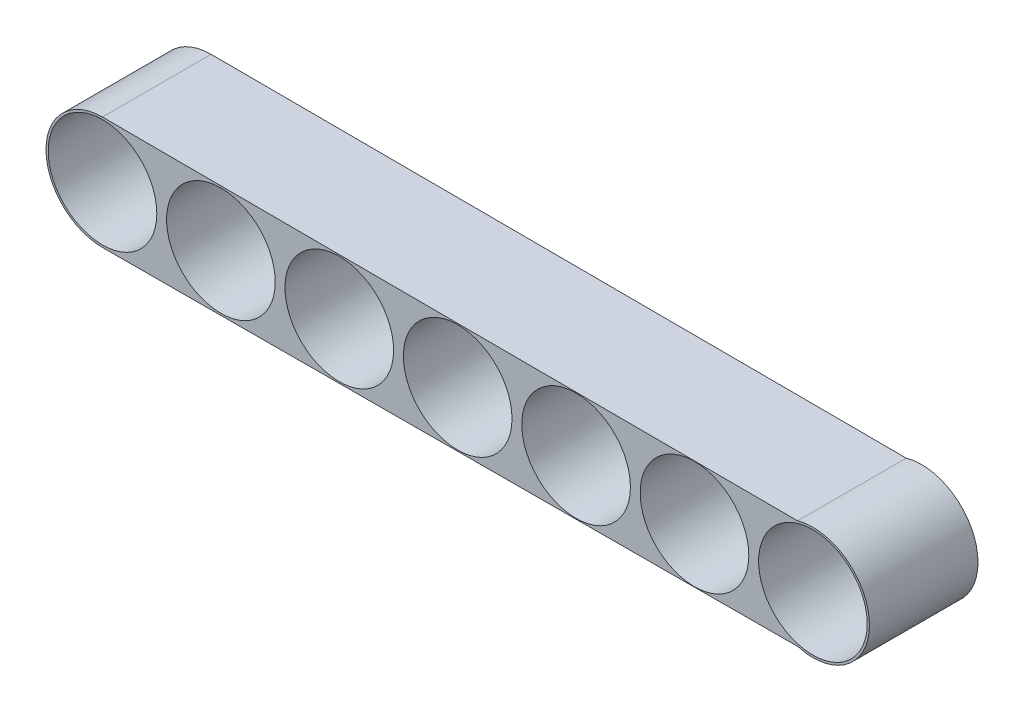
ISO-10303-21;
HEADER;
FILE_DESCRIPTION(('STEP AP214'),'2;1');
FILE_NAME('part.step','',(''),(''),'','','');
FILE_SCHEMA(('AUTOMOTIVE_DESIGN { 1 0 10303 214 1 1 1 1 }'));
ENDSEC;
DATA;
#1=APPLICATION_CONTEXT('core data for automotive mechanical design processes');
#2=APPLICATION_PROTOCOL_DEFINITION('international standard','automotive_design',2000,#1);
#3=PRODUCT_CONTEXT('',#1,'mechanical');
#4=PRODUCT('Part','Part','',(#3));
#5=PRODUCT_RELATED_PRODUCT_CATEGORY('part','',(#4));
#6=PRODUCT_DEFINITION_FORMATION('','',#4);
#7=PRODUCT_DEFINITION_CONTEXT('part definition',#1,'design');
#8=PRODUCT_DEFINITION('design','',#6,#7);
#9=PRODUCT_DEFINITION_SHAPE('','',#8);
#10=(LENGTH_UNIT() NAMED_UNIT(*) SI_UNIT(.MILLI.,.METRE.));
#11=(NAMED_UNIT(*) PLANE_ANGLE_UNIT() SI_UNIT($,.RADIAN.));
#12=(NAMED_UNIT(*) SI_UNIT($,.STERADIAN.) SOLID_ANGLE_UNIT());
#13=UNCERTAINTY_MEASURE_WITH_UNIT(LENGTH_MEASURE(1.E-05),#10,'distance_accuracy_value','');
#14=(GEOMETRIC_REPRESENTATION_CONTEXT(3) GLOBAL_UNCERTAINTY_ASSIGNED_CONTEXT((#13)) GLOBAL_UNIT_ASSIGNED_CONTEXT((#10,
#11,#12)) REPRESENTATION_CONTEXT('',''));
#15=CARTESIAN_POINT('',(0.,0.,0.));
#16=DIRECTION('',(0.,0.,1.));
#17=DIRECTION('',(1.,0.,0.));
#18=AXIS2_PLACEMENT_3D('',#15,#16,#17);
#19=CARTESIAN_POINT('',(0.00159019919573551,-0.519995137005517,1.));
#20=DIRECTION('',(-0.00305808967594135,0.999995324032835,0.));
#21=DIRECTION('',(-0.999995324032835,-0.00305808967594135,0.));
#22=AXIS2_PLACEMENT_3D('',#19,#20,#21);
#23=PLANE('',#22);
#24=DIRECTION('',(0.999995324032835,0.00305808967594135,0.));
#25=VECTOR('',#24,1.);
#26=CARTESIAN_POINT('',(0.00159019919573551,-0.519995137005517,0.));
#27=LINE('',#26,#25);
#28=CARTESIAN_POINT('',(0.,-0.52,0.));
#29=VERTEX_POINT('',#28);
#30=CARTESIAN_POINT('',(6.39869295269132,-0.500432131643146,0.));
#31=VERTEX_POINT('',#30);
#32=EDGE_CURVE('E120',#29,#31,#27,.T.);
#33=ORIENTED_EDGE('',*,*,#32,.T.);
#34=DIRECTION('',(0.,0.,-1.));
#35=VECTOR('',#34,1.);
#36=CARTESIAN_POINT('',(6.39869295269132,-0.500432131643146,1.));
#37=LINE('',#36,#35);
#38=CARTESIAN_POINT('',(6.39869295269132,-0.500432131643146,1.));
#39=VERTEX_POINT('',#38);
#40=EDGE_CURVE('E11',#39,#31,#37,.T.);
#41=ORIENTED_EDGE('',*,*,#40,.F.);
#42=DIRECTION('',(0.999995324032835,0.00305808967594135,0.));
#43=VECTOR('',#42,1.);
#44=CARTESIAN_POINT('',(0.00159019919573551,-0.519995137005517,1.));
#45=LINE('',#44,#43);
#46=CARTESIAN_POINT('',(0.,-0.52,1.));
#47=VERTEX_POINT('',#46);
#48=EDGE_CURVE('E84',#47,#39,#45,.T.);
#49=ORIENTED_EDGE('',*,*,#48,.F.);
#50=DIRECTION('',(0.,0.,-1.));
#51=VECTOR('',#50,1.);
#52=CARTESIAN_POINT('',(0.,-0.52,1.));
#53=LINE('',#52,#51);
#54=EDGE_CURVE('E116',#47,#29,#53,.T.);
#55=ORIENTED_EDGE('',*,*,#54,.T.);
#56=EDGE_LOOP('',(#33,#41,#49,#55));
#57=FACE_BOUND('',#56,.T.);
#58=ADVANCED_FACE('F35',(#57),#23,.F.);
#59=CARTESIAN_POINT('',(6.54,0.,1.));
#60=DIRECTION('',(0.,0.,-1.));
#61=DIRECTION('',(-1.,0.,0.));
#62=AXIS2_PLACEMENT_3D('',#59,#60,#61);
#63=CYLINDRICAL_SURFACE('',#62,0.519999999999999);
#64=CARTESIAN_POINT('',(6.54,0.,0.));
#65=DIRECTION('',(0.,0.,1.));
#66=DIRECTION('',(1.,0.,0.));
#67=AXIS2_PLACEMENT_3D('',#64,#65,#66);
#68=CIRCLE('',#67,0.519999999999999);
#69=CARTESIAN_POINT('',(6.39869295269132,0.500432131643146,0.));
#70=VERTEX_POINT('',#69);
#71=EDGE_CURVE('E89',#31,#70,#68,.T.);
#72=ORIENTED_EDGE('',*,*,#71,.T.);
#73=DIRECTION('',(0.,0.,-1.));
#74=VECTOR('',#73,1.);
#75=CARTESIAN_POINT('',(6.39869295269132,0.500432131643146,1.));
#76=LINE('',#75,#74);
#77=CARTESIAN_POINT('',(6.39869295269132,0.500432131643146,1.));
#78=VERTEX_POINT('',#77);
#79=EDGE_CURVE('E44',#78,#70,#76,.T.);
#80=ORIENTED_EDGE('',*,*,#79,.F.);
#81=CARTESIAN_POINT('',(6.54,0.,1.));
#82=DIRECTION('',(0.,0.,1.));
#83=DIRECTION('',(1.,0.,0.));
#84=AXIS2_PLACEMENT_3D('',#81,#82,#83);
#85=CIRCLE('',#84,0.519999999999999);
#86=EDGE_CURVE('E78',#39,#78,#85,.T.);
#87=ORIENTED_EDGE('',*,*,#86,.F.);
#88=ORIENTED_EDGE('',*,*,#40,.T.);
#89=EDGE_LOOP('',(#72,#80,#87,#88));
#90=FACE_BOUND('',#89,.T.);
#91=ADVANCED_FACE('F88',(#90),#63,.T.);
#92=CARTESIAN_POINT('',(0.00159019919573551,0.519995137005517,1.));
#93=DIRECTION('',(0.00305808967594135,0.999995324032835,0.));
#94=DIRECTION('',(-0.999995324032835,0.00305808967594135,0.));
#95=AXIS2_PLACEMENT_3D('',#92,#93,#94);
#96=PLANE('',#95);
#97=DIRECTION('',(0.999995324032835,-0.00305808967594135,0.));
#98=VECTOR('',#97,1.);
#99=CARTESIAN_POINT('',(0.00159019919573551,0.519995137005517,0.));
#100=LINE('',#99,#98);
#101=CARTESIAN_POINT('',(0.,0.52,0.));
#102=VERTEX_POINT('',#101);
#103=EDGE_CURVE('E124',#102,#70,#100,.T.);
#104=ORIENTED_EDGE('',*,*,#103,.F.);
#105=DIRECTION('',(0.,0.,-1.));
#106=VECTOR('',#105,1.);
#107=CARTESIAN_POINT('',(0.,0.52,1.));
#108=LINE('',#107,#106);
#109=CARTESIAN_POINT('',(0.,0.52,1.));
#110=VERTEX_POINT('',#109);
#111=EDGE_CURVE('E68',#110,#102,#108,.T.);
#112=ORIENTED_EDGE('',*,*,#111,.F.);
#113=DIRECTION('',(0.999995324032835,-0.00305808967594135,0.));
#114=VECTOR('',#113,1.);
#115=CARTESIAN_POINT('',(0.00159019919573551,0.519995137005517,1.));
#116=LINE('',#115,#114);
#117=EDGE_CURVE('E82',#110,#78,#116,.T.);
#118=ORIENTED_EDGE('',*,*,#117,.T.);
#119=ORIENTED_EDGE('',*,*,#79,.T.);
#120=EDGE_LOOP('',(#104,#112,#118,#119));
#121=FACE_BOUND('',#120,.T.);
#122=ADVANCED_FACE('F93',(#121),#96,.T.);
#123=CARTESIAN_POINT('',(1.09,0.,1.));
#124=DIRECTION('',(0.,0.,-1.));
#125=DIRECTION('',(-1.,0.,0.));
#126=AXIS2_PLACEMENT_3D('',#123,#124,#125);
#127=CYLINDRICAL_SURFACE('',#126,0.5);
#128=CARTESIAN_POINT('',(1.09,0.,1.));
#129=DIRECTION('',(0.,0.,1.));
#130=DIRECTION('',(1.,0.,0.));
#131=AXIS2_PLACEMENT_3D('',#128,#129,#130);
#132=CIRCLE('',#131,0.5);
#133=CARTESIAN_POINT('',(1.59,0.,1.));
#134=VERTEX_POINT('',#133);
#135=EDGE_CURVE('E110',#134,#134,#132,.T.);
#136=ORIENTED_EDGE('',*,*,#135,.T.);
#137=EDGE_LOOP('',(#136));
#138=FACE_BOUND('',#137,.T.);
#139=CARTESIAN_POINT('',(1.09,0.,0.));
#140=DIRECTION('',(0.,0.,1.));
#141=DIRECTION('',(1.,0.,0.));
#142=AXIS2_PLACEMENT_3D('',#139,#140,#141);
#143=CIRCLE('',#142,0.5);
#144=CARTESIAN_POINT('',(1.59,0.,0.));
#145=VERTEX_POINT('',#144);
#146=EDGE_CURVE('E139',#145,#145,#143,.T.);
#147=ORIENTED_EDGE('',*,*,#146,.F.);
#148=EDGE_LOOP('',(#147));
#149=FACE_BOUND('',#148,.T.);
#150=ADVANCED_FACE('F188',(#138,#149),#127,.F.);
#151=CARTESIAN_POINT('',(2.18,0.,1.));
#152=DIRECTION('',(0.,0.,-1.));
#153=DIRECTION('',(-1.,0.,0.));
#154=AXIS2_PLACEMENT_3D('',#151,#152,#153);
#155=CYLINDRICAL_SURFACE('',#154,0.5);
#156=CARTESIAN_POINT('',(2.18,0.,1.));
#157=DIRECTION('',(0.,0.,1.));
#158=DIRECTION('',(1.,0.,0.));
#159=AXIS2_PLACEMENT_3D('',#156,#157,#158);
#160=CIRCLE('',#159,0.5);
#161=CARTESIAN_POINT('',(2.68,0.,1.));
#162=VERTEX_POINT('',#161);
#163=EDGE_CURVE('E107',#162,#162,#160,.T.);
#164=ORIENTED_EDGE('',*,*,#163,.T.);
#165=EDGE_LOOP('',(#164));
#166=FACE_BOUND('',#165,.T.);
#167=CARTESIAN_POINT('',(2.18,0.,0.));
#168=DIRECTION('',(0.,0.,1.));
#169=DIRECTION('',(1.,0.,0.));
#170=AXIS2_PLACEMENT_3D('',#167,#168,#169);
#171=CIRCLE('',#170,0.5);
#172=CARTESIAN_POINT('',(2.68,0.,0.));
#173=VERTEX_POINT('',#172);
#174=EDGE_CURVE('E136',#173,#173,#171,.T.);
#175=ORIENTED_EDGE('',*,*,#174,.F.);
#176=EDGE_LOOP('',(#175));
#177=FACE_BOUND('',#176,.T.);
#178=ADVANCED_FACE('F202',(#166,#177),#155,.F.);
#179=CARTESIAN_POINT('',(3.27,0.,1.));
#180=DIRECTION('',(0.,0.,-1.));
#181=DIRECTION('',(-1.,0.,0.));
#182=AXIS2_PLACEMENT_3D('',#179,#180,#181);
#183=CYLINDRICAL_SURFACE('',#182,0.5);
#184=CARTESIAN_POINT('',(3.27,0.,1.));
#185=DIRECTION('',(0.,0.,1.));
#186=DIRECTION('',(1.,0.,0.));
#187=AXIS2_PLACEMENT_3D('',#184,#185,#186);
#188=CIRCLE('',#187,0.5);
#189=CARTESIAN_POINT('',(3.77,0.,1.));
#190=VERTEX_POINT('',#189);
#191=EDGE_CURVE('E104',#190,#190,#188,.T.);
#192=ORIENTED_EDGE('',*,*,#191,.T.);
#193=EDGE_LOOP('',(#192));
#194=FACE_BOUND('',#193,.T.);
#195=CARTESIAN_POINT('',(3.27,0.,0.));
#196=DIRECTION('',(0.,0.,1.));
#197=DIRECTION('',(1.,0.,0.));
#198=AXIS2_PLACEMENT_3D('',#195,#196,#197);
#199=CIRCLE('',#198,0.5);
#200=CARTESIAN_POINT('',(3.77,0.,0.));
#201=VERTEX_POINT('',#200);
#202=EDGE_CURVE('E133',#201,#201,#199,.T.);
#203=ORIENTED_EDGE('',*,*,#202,.F.);
#204=EDGE_LOOP('',(#203));
#205=FACE_BOUND('',#204,.T.);
#206=ADVANCED_FACE('F198',(#194,#205),#183,.F.);
#207=CARTESIAN_POINT('',(4.36,0.,1.));
#208=DIRECTION('',(0.,0.,-1.));
#209=DIRECTION('',(-1.,0.,0.));
#210=AXIS2_PLACEMENT_3D('',#207,#208,#209);
#211=CYLINDRICAL_SURFACE('',#210,0.5);
#212=CARTESIAN_POINT('',(4.36,0.,1.));
#213=DIRECTION('',(0.,0.,1.));
#214=DIRECTION('',(1.,0.,0.));
#215=AXIS2_PLACEMENT_3D('',#212,#213,#214);
#216=CIRCLE('',#215,0.5);
#217=CARTESIAN_POINT('',(4.86,0.,1.));
#218=VERTEX_POINT('',#217);
#219=EDGE_CURVE('E101',#218,#218,#216,.T.);
#220=ORIENTED_EDGE('',*,*,#219,.T.);
#221=EDGE_LOOP('',(#220));
#222=FACE_BOUND('',#221,.T.);
#223=CARTESIAN_POINT('',(4.36,0.,0.));
#224=DIRECTION('',(0.,0.,1.));
#225=DIRECTION('',(1.,0.,0.));
#226=AXIS2_PLACEMENT_3D('',#223,#224,#225);
#227=CIRCLE('',#226,0.5);
#228=CARTESIAN_POINT('',(4.86,0.,0.));
#229=VERTEX_POINT('',#228);
#230=EDGE_CURVE('E130',#229,#229,#227,.T.);
#231=ORIENTED_EDGE('',*,*,#230,.F.);
#232=EDGE_LOOP('',(#231));
#233=FACE_BOUND('',#232,.T.);
#234=ADVANCED_FACE('F194',(#222,#233),#211,.F.);
#235=CARTESIAN_POINT('',(5.45,0.,1.));
#236=DIRECTION('',(0.,0.,-1.));
#237=DIRECTION('',(-1.,0.,0.));
#238=AXIS2_PLACEMENT_3D('',#235,#236,#237);
#239=CYLINDRICAL_SURFACE('',#238,0.5);
#240=CARTESIAN_POINT('',(5.45,0.,1.));
#241=DIRECTION('',(0.,0.,1.));
#242=DIRECTION('',(1.,0.,0.));
#243=AXIS2_PLACEMENT_3D('',#240,#241,#242);
#244=CIRCLE('',#243,0.5);
#245=CARTESIAN_POINT('',(5.95,0.,1.));
#246=VERTEX_POINT('',#245);
#247=EDGE_CURVE('E95',#246,#246,#244,.T.);
#248=ORIENTED_EDGE('',*,*,#247,.T.);
#249=EDGE_LOOP('',(#248));
#250=FACE_BOUND('',#249,.T.);
#251=CARTESIAN_POINT('',(5.45,0.,0.));
#252=DIRECTION('',(0.,0.,1.));
#253=DIRECTION('',(1.,0.,0.));
#254=AXIS2_PLACEMENT_3D('',#251,#252,#253);
#255=CIRCLE('',#254,0.5);
#256=CARTESIAN_POINT('',(5.95,0.,0.));
#257=VERTEX_POINT('',#256);
#258=EDGE_CURVE('E127',#257,#257,#255,.T.);
#259=ORIENTED_EDGE('',*,*,#258,.F.);
#260=EDGE_LOOP('',(#259));
#261=FACE_BOUND('',#260,.T.);
#262=ADVANCED_FACE('F191',(#250,#261),#239,.F.);
#263=CARTESIAN_POINT('',(0.,0.,1.));
#264=DIRECTION('',(0.,0.,-1.));
#265=DIRECTION('',(-1.,0.,0.));
#266=AXIS2_PLACEMENT_3D('',#263,#264,#265);
#267=CYLINDRICAL_SURFACE('',#266,0.52);
#268=CARTESIAN_POINT('',(0.,0.,0.));
#269=DIRECTION('',(0.,0.,1.));
#270=DIRECTION('',(1.,0.,0.));
#271=AXIS2_PLACEMENT_3D('',#268,#269,#270);
#272=CIRCLE('',#271,0.52);
#273=EDGE_CURVE('E71',#102,#29,#272,.T.);
#274=ORIENTED_EDGE('',*,*,#273,.T.);
#275=ORIENTED_EDGE('',*,*,#54,.F.);
#276=CARTESIAN_POINT('',(0.,0.,1.));
#277=DIRECTION('',(0.,0.,1.));
#278=DIRECTION('',(1.,0.,0.));
#279=AXIS2_PLACEMENT_3D('',#276,#277,#278);
#280=CIRCLE('',#279,0.52);
#281=EDGE_CURVE('E52',#110,#47,#280,.T.);
#282=ORIENTED_EDGE('',*,*,#281,.F.);
#283=ORIENTED_EDGE('',*,*,#111,.T.);
#284=EDGE_LOOP('',(#274,#275,#282,#283));
#285=FACE_BOUND('',#284,.T.);
#286=ADVANCED_FACE('F177',(#285),#267,.T.);
#287=CARTESIAN_POINT('',(6.54,0.,1.));
#288=DIRECTION('',(0.,0.,-1.));
#289=DIRECTION('',(-1.,0.,0.));
#290=AXIS2_PLACEMENT_3D('',#287,#288,#289);
#291=CYLINDRICAL_SURFACE('',#290,0.5);
#292=CARTESIAN_POINT('',(6.54,0.,1.));
#293=DIRECTION('',(0.,0.,1.));
#294=DIRECTION('',(1.,0.,0.));
#295=AXIS2_PLACEMENT_3D('',#292,#293,#294);
#296=CIRCLE('',#295,0.5);
#297=CARTESIAN_POINT('',(7.04,0.,1.));
#298=VERTEX_POINT('',#297);
#299=EDGE_CURVE('E145',#298,#298,#296,.T.);
#300=ORIENTED_EDGE('',*,*,#299,.T.);
#301=EDGE_LOOP('',(#300));
#302=FACE_BOUND('',#301,.T.);
#303=CARTESIAN_POINT('',(6.54,0.,0.));
#304=DIRECTION('',(0.,0.,1.));
#305=DIRECTION('',(1.,0.,0.));
#306=AXIS2_PLACEMENT_3D('',#303,#304,#305);
#307=CIRCLE('',#306,0.5);
#308=CARTESIAN_POINT('',(7.04,0.,0.));
#309=VERTEX_POINT('',#308);
#310=EDGE_CURVE('E117',#309,#309,#307,.T.);
#311=ORIENTED_EDGE('',*,*,#310,.F.);
#312=EDGE_LOOP('',(#311));
#313=FACE_BOUND('',#312,.T.);
#314=ADVANCED_FACE('F37',(#302,#313),#291,.F.);
#315=CARTESIAN_POINT('',(0.,0.,1.));
#316=DIRECTION('',(0.,0.,-1.));
#317=DIRECTION('',(-1.,0.,0.));
#318=AXIS2_PLACEMENT_3D('',#315,#316,#317);
#319=CYLINDRICAL_SURFACE('',#318,0.5);
#320=CARTESIAN_POINT('',(0.,0.,1.));
#321=DIRECTION('',(0.,0.,1.));
#322=DIRECTION('',(1.,0.,0.));
#323=AXIS2_PLACEMENT_3D('',#320,#321,#322);
#324=CIRCLE('',#323,0.5);
#325=CARTESIAN_POINT('',(0.5,0.,1.));
#326=VERTEX_POINT('',#325);
#327=EDGE_CURVE('E113',#326,#326,#324,.T.);
#328=ORIENTED_EDGE('',*,*,#327,.T.);
#329=EDGE_LOOP('',(#328));
#330=FACE_BOUND('',#329,.T.);
#331=CARTESIAN_POINT('',(0.,0.,0.));
#332=DIRECTION('',(0.,0.,1.));
#333=DIRECTION('',(1.,0.,0.));
#334=AXIS2_PLACEMENT_3D('',#331,#332,#333);
#335=CIRCLE('',#334,0.5);
#336=CARTESIAN_POINT('',(0.5,0.,0.));
#337=VERTEX_POINT('',#336);
#338=EDGE_CURVE('E142',#337,#337,#335,.T.);
#339=ORIENTED_EDGE('',*,*,#338,.F.);
#340=EDGE_LOOP('',(#339));
#341=FACE_BOUND('',#340,.T.);
#342=ADVANCED_FACE('F167',(#330,#341),#319,.F.);
#343=CARTESIAN_POINT('',(0.,0.,1.));
#344=DIRECTION('',(0.,0.,1.));
#345=DIRECTION('',(1.,0.,0.));
#346=AXIS2_PLACEMENT_3D('',#343,#344,#345);
#347=PLANE('',#346);
#348=ORIENTED_EDGE('',*,*,#299,.F.);
#349=EDGE_LOOP('',(#348));
#350=FACE_BOUND('',#349,.T.);
#351=ORIENTED_EDGE('',*,*,#48,.T.);
#352=ORIENTED_EDGE('',*,*,#86,.T.);
#353=ORIENTED_EDGE('',*,*,#117,.F.);
#354=ORIENTED_EDGE('',*,*,#281,.T.);
#355=EDGE_LOOP('',(#351,#352,#353,#354));
#356=FACE_BOUND('',#355,.T.);
#357=ORIENTED_EDGE('',*,*,#247,.F.);
#358=EDGE_LOOP('',(#357));
#359=FACE_BOUND('',#358,.T.);
#360=ORIENTED_EDGE('',*,*,#219,.F.);
#361=EDGE_LOOP('',(#360));
#362=FACE_BOUND('',#361,.T.);
#363=ORIENTED_EDGE('',*,*,#191,.F.);
#364=EDGE_LOOP('',(#363));
#365=FACE_BOUND('',#364,.T.);
#366=ORIENTED_EDGE('',*,*,#163,.F.);
#367=EDGE_LOOP('',(#366));
#368=FACE_BOUND('',#367,.T.);
#369=ORIENTED_EDGE('',*,*,#135,.F.);
#370=EDGE_LOOP('',(#369));
#371=FACE_BOUND('',#370,.T.);
#372=ORIENTED_EDGE('',*,*,#327,.F.);
#373=EDGE_LOOP('',(#372));
#374=FACE_BOUND('',#373,.T.);
#375=ADVANCED_FACE('F79',(#350,#356,#359,#362,#365,#368,#371,#374),#347,.T.);
#376=CARTESIAN_POINT('',(0.,0.,0.));
#377=DIRECTION('',(0.,0.,1.));
#378=DIRECTION('',(1.,0.,0.));
#379=AXIS2_PLACEMENT_3D('',#376,#377,#378);
#380=PLANE('',#379);
#381=ORIENTED_EDGE('',*,*,#310,.T.);
#382=EDGE_LOOP('',(#381));
#383=FACE_BOUND('',#382,.T.);
#384=ORIENTED_EDGE('',*,*,#32,.F.);
#385=ORIENTED_EDGE('',*,*,#273,.F.);
#386=ORIENTED_EDGE('',*,*,#103,.T.);
#387=ORIENTED_EDGE('',*,*,#71,.F.);
#388=EDGE_LOOP('',(#384,#385,#386,#387));
#389=FACE_BOUND('',#388,.T.);
#390=ORIENTED_EDGE('',*,*,#258,.T.);
#391=EDGE_LOOP('',(#390));
#392=FACE_BOUND('',#391,.T.);
#393=ORIENTED_EDGE('',*,*,#230,.T.);
#394=EDGE_LOOP('',(#393));
#395=FACE_BOUND('',#394,.T.);
#396=ORIENTED_EDGE('',*,*,#202,.T.);
#397=EDGE_LOOP('',(#396));
#398=FACE_BOUND('',#397,.T.);
#399=ORIENTED_EDGE('',*,*,#174,.T.);
#400=EDGE_LOOP('',(#399));
#401=FACE_BOUND('',#400,.T.);
#402=ORIENTED_EDGE('',*,*,#146,.T.);
#403=EDGE_LOOP('',(#402));
#404=FACE_BOUND('',#403,.T.);
#405=ORIENTED_EDGE('',*,*,#338,.T.);
#406=EDGE_LOOP('',(#405));
#407=FACE_BOUND('',#406,.T.);
#408=ADVANCED_FACE('F150',(#383,#389,#392,#395,#398,#401,#404,#407),#380,.F.);
#409=CLOSED_SHELL('',(#58,#91,#122,#150,#178,#206,#234,#262,#286,#314,#342,#375,#408));
#410=MANIFOLD_SOLID_BREP('B2',#409);
#411=ADVANCED_BREP_SHAPE_REPRESENTATION('',(#18,#410),#14);
#412=SHAPE_DEFINITION_REPRESENTATION(#9,#411);
ENDSEC;
END-ISO-10303-21;
